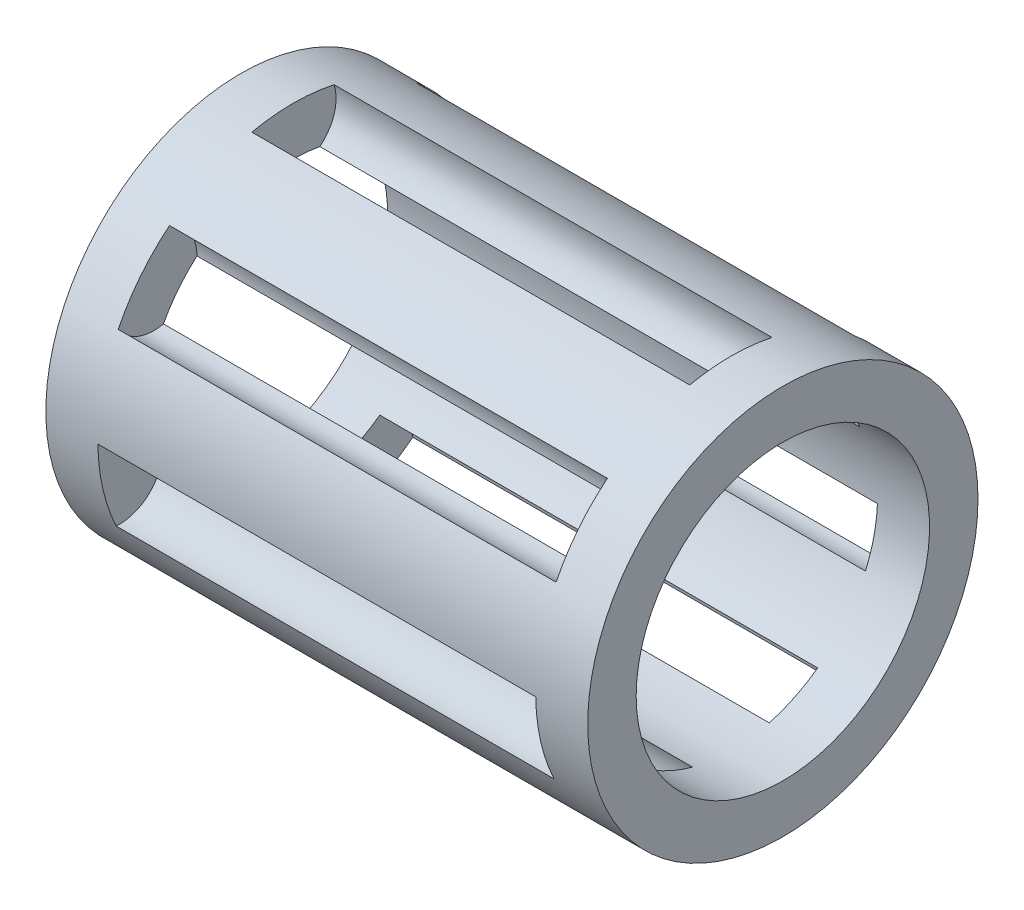
ISO-10303-21;
HEADER;
FILE_DESCRIPTION(('STEP AP214'),'2;1');
FILE_NAME('part.step','',(''),(''),'','','');
FILE_SCHEMA(('AUTOMOTIVE_DESIGN { 1 0 10303 214 1 1 1 1 }'));
ENDSEC;
DATA;
#1=APPLICATION_CONTEXT('core data for automotive mechanical design processes');
#2=APPLICATION_PROTOCOL_DEFINITION('international standard','automotive_design',2000,#1);
#3=PRODUCT_CONTEXT('',#1,'mechanical');
#4=PRODUCT('Part','Part','',(#3));
#5=PRODUCT_RELATED_PRODUCT_CATEGORY('part','',(#4));
#6=PRODUCT_DEFINITION_FORMATION('','',#4);
#7=PRODUCT_DEFINITION_CONTEXT('part definition',#1,'design');
#8=PRODUCT_DEFINITION('design','',#6,#7);
#9=PRODUCT_DEFINITION_SHAPE('','',#8);
#10=(LENGTH_UNIT() NAMED_UNIT(*) SI_UNIT(.MILLI.,.METRE.));
#11=(NAMED_UNIT(*) PLANE_ANGLE_UNIT() SI_UNIT($,.RADIAN.));
#12=(NAMED_UNIT(*) SI_UNIT($,.STERADIAN.) SOLID_ANGLE_UNIT());
#13=UNCERTAINTY_MEASURE_WITH_UNIT(LENGTH_MEASURE(1.E-05),#10,'distance_accuracy_value','');
#14=(GEOMETRIC_REPRESENTATION_CONTEXT(3) GLOBAL_UNCERTAINTY_ASSIGNED_CONTEXT((#13)) GLOBAL_UNIT_ASSIGNED_CONTEXT((#10,
#11,#12)) REPRESENTATION_CONTEXT('',''));
#15=CARTESIAN_POINT('',(0.,0.,0.));
#16=DIRECTION('',(0.,0.,1.));
#17=DIRECTION('',(1.,0.,0.));
#18=AXIS2_PLACEMENT_3D('',#15,#16,#17);
#19=CARTESIAN_POINT('',(10.95,0.,0.));
#20=DIRECTION('',(1.,0.,0.));
#21=DIRECTION('',(0.,0.,-1.));
#22=AXIS2_PLACEMENT_3D('',#19,#20,#21);
#23=PLANE('',#22);
#24=CARTESIAN_POINT('',(10.95,0.,0.));
#25=DIRECTION('',(1.,0.,0.));
#26=DIRECTION('',(0.,0.,-1.));
#27=AXIS2_PLACEMENT_3D('',#24,#25,#26);
#28=CIRCLE('',#27,3.565);
#29=CARTESIAN_POINT('',(10.95,0.,-3.565));
#30=VERTEX_POINT('',#29);
#31=EDGE_CURVE('E11',#30,#30,#28,.T.);
#32=ORIENTED_EDGE('',*,*,#31,.T.);
#33=EDGE_LOOP('',(#32));
#34=FACE_BOUND('',#33,.T.);
#35=CARTESIAN_POINT('',(10.95,0.,0.));
#36=DIRECTION('',(-1.,0.,0.));
#37=DIRECTION('',(0.,0.,-1.));
#38=AXIS2_PLACEMENT_3D('',#35,#36,#37);
#39=CIRCLE('',#38,2.68);
#40=CARTESIAN_POINT('',(10.95,0.,2.68));
#41=VERTEX_POINT('',#40);
#42=EDGE_CURVE('E327',#41,#41,#39,.T.);
#43=ORIENTED_EDGE('',*,*,#42,.T.);
#44=EDGE_LOOP('',(#43));
#45=FACE_BOUND('',#44,.T.);
#46=ADVANCED_FACE('F17',(#34,#45),#23,.T.);
#47=CARTESIAN_POINT('',(1.05,0.,0.));
#48=DIRECTION('',(-1.,0.,0.));
#49=DIRECTION('',(0.,0.,1.));
#50=AXIS2_PLACEMENT_3D('',#47,#48,#49);
#51=PLANE('',#50);
#52=CARTESIAN_POINT('',(1.05,0.,0.));
#53=DIRECTION('',(-1.,0.,0.));
#54=DIRECTION('',(0.,0.,-1.));
#55=AXIS2_PLACEMENT_3D('',#52,#53,#54);
#56=CIRCLE('',#55,3.565);
#57=CARTESIAN_POINT('',(1.05,0.,-3.565));
#58=VERTEX_POINT('',#57);
#59=EDGE_CURVE('E27',#58,#58,#56,.T.);
#60=ORIENTED_EDGE('',*,*,#59,.T.);
#61=EDGE_LOOP('',(#60));
#62=FACE_BOUND('',#61,.T.);
#63=CARTESIAN_POINT('',(1.05,0.,0.));
#64=DIRECTION('',(1.,0.,0.));
#65=DIRECTION('',(0.,0.,-1.));
#66=AXIS2_PLACEMENT_3D('',#63,#64,#65);
#67=CIRCLE('',#66,2.68);
#68=CARTESIAN_POINT('',(1.05,0.,2.68));
#69=VERTEX_POINT('',#68);
#70=EDGE_CURVE('E325',#69,#69,#67,.T.);
#71=ORIENTED_EDGE('',*,*,#70,.T.);
#72=EDGE_LOOP('',(#71));
#73=FACE_BOUND('',#72,.T.);
#74=ADVANCED_FACE('F484',(#62,#73),#51,.T.);
#75=CARTESIAN_POINT('',(6.,0.,0.));
#76=DIRECTION('',(-1.,0.,0.));
#77=DIRECTION('',(0.,0.,-1.));
#78=AXIS2_PLACEMENT_3D('',#75,#76,#77);
#79=CYLINDRICAL_SURFACE('',#78,3.565);
#80=ORIENTED_EDGE('',*,*,#31,.F.);
#81=EDGE_LOOP('',(#80));
#82=FACE_BOUND('',#81,.T.);
#83=ORIENTED_EDGE('',*,*,#59,.F.);
#84=EDGE_LOOP('',(#83));
#85=FACE_BOUND('',#84,.T.);
#86=DIRECTION('',(1.,0.,0.));
#87=VECTOR('',#86,1.);
#88=CARTESIAN_POINT('',(6.,3.48485673076923,-0.75166386504367));
#89=LINE('',#88,#87);
#90=CARTESIAN_POINT('',(2.,3.48485673076923,-0.75166386504367));
#91=VERTEX_POINT('',#90);
#92=CARTESIAN_POINT('',(10.,3.48485673076923,-0.75166386504367));
#93=VERTEX_POINT('',#92);
#94=EDGE_CURVE('E277',#91,#93,#89,.T.);
#95=ORIENTED_EDGE('',*,*,#94,.T.);
#96=CARTESIAN_POINT('',(10.,0.,0.));
#97=DIRECTION('',(1.,0.,0.));
#98=DIRECTION('',(0.,0.,-1.));
#99=AXIS2_PLACEMENT_3D('',#96,#97,#98);
#100=CIRCLE('',#99,3.565);
#101=CARTESIAN_POINT('',(10.,3.48485673076923,0.75166386504367));
#102=VERTEX_POINT('',#101);
#103=EDGE_CURVE('E353',#93,#102,#100,.T.);
#104=ORIENTED_EDGE('',*,*,#103,.T.);
#105=DIRECTION('',(-1.,0.,0.));
#106=VECTOR('',#105,1.);
#107=CARTESIAN_POINT('',(6.,3.48485673076923,0.75166386504367));
#108=LINE('',#107,#106);
#109=CARTESIAN_POINT('',(2.,3.48485673076923,0.75166386504367));
#110=VERTEX_POINT('',#109);
#111=EDGE_CURVE('E301',#102,#110,#108,.T.);
#112=ORIENTED_EDGE('',*,*,#111,.T.);
#113=CARTESIAN_POINT('',(2.,0.,0.));
#114=DIRECTION('',(-1.,0.,0.));
#115=DIRECTION('',(0.,0.,-1.));
#116=AXIS2_PLACEMENT_3D('',#113,#114,#115);
#117=CIRCLE('',#116,3.565);
#118=EDGE_CURVE('E253',#110,#91,#117,.T.);
#119=ORIENTED_EDGE('',*,*,#118,.T.);
#120=EDGE_LOOP('',(#95,#104,#112,#119));
#121=FACE_BOUND('',#120,.T.);
#122=DIRECTION('',(1.,0.,0.));
#123=VECTOR('',#122,1.);
#124=CARTESIAN_POINT('',(6.,2.76044710649813,2.25591594972555));
#125=LINE('',#124,#123);
#126=CARTESIAN_POINT('',(2.,2.76044710649813,2.25591594972555));
#127=VERTEX_POINT('',#126);
#128=CARTESIAN_POINT('',(10.,2.76044710649813,2.25591594972555));
#129=VERTEX_POINT('',#128);
#130=EDGE_CURVE('E281',#127,#129,#125,.T.);
#131=ORIENTED_EDGE('',*,*,#130,.T.);
#132=CARTESIAN_POINT('',(10.,0.,0.));
#133=DIRECTION('',(1.,0.,0.));
#134=DIRECTION('',(0.,0.,-1.));
#135=AXIS2_PLACEMENT_3D('',#132,#133,#134);
#136=CIRCLE('',#135,3.565);
#137=CARTESIAN_POINT('',(10.,1.58509815864864,3.19322545828644));
#138=VERTEX_POINT('',#137);
#139=EDGE_CURVE('E324',#129,#138,#136,.T.);
#140=ORIENTED_EDGE('',*,*,#139,.T.);
#141=DIRECTION('',(-1.,0.,0.));
#142=VECTOR('',#141,1.);
#143=CARTESIAN_POINT('',(6.,1.58509815864864,3.19322545828644));
#144=LINE('',#143,#142);
#145=CARTESIAN_POINT('',(2.,1.58509815864864,3.19322545828644));
#146=VERTEX_POINT('',#145);
#147=EDGE_CURVE('E222',#138,#146,#144,.T.);
#148=ORIENTED_EDGE('',*,*,#147,.T.);
#149=CARTESIAN_POINT('',(2.,0.,0.));
#150=DIRECTION('',(-1.,0.,0.));
#151=DIRECTION('',(0.,0.,-1.));
#152=AXIS2_PLACEMENT_3D('',#149,#150,#151);
#153=CIRCLE('',#152,3.565);
#154=EDGE_CURVE('E219',#146,#127,#153,.T.);
#155=ORIENTED_EDGE('',*,*,#154,.T.);
#156=EDGE_LOOP('',(#131,#140,#148,#155));
#157=FACE_BOUND('',#156,.T.);
#158=DIRECTION('',(1.,0.,0.));
#159=VECTOR('',#158,1.);
#160=CARTESIAN_POINT('',(6.,-0.0426354918251722,3.56474504205235));
#161=LINE('',#160,#159);
#162=CARTESIAN_POINT('',(2.,-0.0426354918251722,3.56474504205235));
#163=VERTEX_POINT('',#162);
#164=CARTESIAN_POINT('',(10.,-0.0426354918251722,3.56474504205235));
#165=VERTEX_POINT('',#164);
#166=EDGE_CURVE('E210',#163,#165,#161,.T.);
#167=ORIENTED_EDGE('',*,*,#166,.T.);
#168=CARTESIAN_POINT('',(10.,0.,0.));
#169=DIRECTION('',(1.,0.,0.));
#170=DIRECTION('',(0.,0.,-1.));
#171=AXIS2_PLACEMENT_3D('',#168,#169,#170);
#172=CIRCLE('',#171,3.565);
#173=CARTESIAN_POINT('',(10.,-1.50827165704426,3.23022315151089));
#174=VERTEX_POINT('',#173);
#175=EDGE_CURVE('E297',#165,#174,#172,.T.);
#176=ORIENTED_EDGE('',*,*,#175,.T.);
#177=DIRECTION('',(-1.,0.,0.));
#178=VECTOR('',#177,1.);
#179=CARTESIAN_POINT('',(6.,-1.50827165704426,3.23022315151089));
#180=LINE('',#179,#178);
#181=CARTESIAN_POINT('',(2.,-1.50827165704426,3.23022315151089));
#182=VERTEX_POINT('',#181);
#183=EDGE_CURVE('E377',#174,#182,#180,.T.);
#184=ORIENTED_EDGE('',*,*,#183,.T.);
#185=CARTESIAN_POINT('',(2.,0.,0.));
#186=DIRECTION('',(-1.,0.,0.));
#187=DIRECTION('',(0.,0.,-1.));
#188=AXIS2_PLACEMENT_3D('',#185,#186,#187);
#189=CIRCLE('',#188,3.565);
#190=EDGE_CURVE('E241',#182,#163,#189,.T.);
#191=ORIENTED_EDGE('',*,*,#190,.T.);
#192=EDGE_LOOP('',(#167,#176,#184,#191));
#193=FACE_BOUND('',#192,.T.);
#194=DIRECTION('',(1.,0.,0.));
#195=VECTOR('',#194,1.);
#196=CARTESIAN_POINT('',(6.,-2.81361269519858,2.1892484101667));
#197=LINE('',#196,#195);
#198=CARTESIAN_POINT('',(2.,-2.81361269519858,2.1892484101667));
#199=VERTEX_POINT('',#198);
#200=CARTESIAN_POINT('',(10.,-2.81361269519858,2.1892484101667));
#201=VERTEX_POINT('',#200);
#202=EDGE_CURVE('E363',#199,#201,#197,.T.);
#203=ORIENTED_EDGE('',*,*,#202,.T.);
#204=CARTESIAN_POINT('',(10.,0.,0.));
#205=DIRECTION('',(1.,0.,0.));
#206=DIRECTION('',(0.,0.,-1.));
#207=AXIS2_PLACEMENT_3D('',#204,#205,#206);
#208=CIRCLE('',#207,3.565);
#209=CARTESIAN_POINT('',(10.,-3.46588215184798,0.834796927103591));
#210=VERTEX_POINT('',#209);
#211=EDGE_CURVE('E293',#201,#210,#208,.T.);
#212=ORIENTED_EDGE('',*,*,#211,.T.);
#213=DIRECTION('',(-1.,0.,0.));
#214=VECTOR('',#213,1.);
#215=CARTESIAN_POINT('',(6.,-3.46588215184798,0.834796927103591));
#216=LINE('',#215,#214);
#217=CARTESIAN_POINT('',(2.,-3.46588215184798,0.834796927103591));
#218=VERTEX_POINT('',#217);
#219=EDGE_CURVE('E180',#210,#218,#216,.T.);
#220=ORIENTED_EDGE('',*,*,#219,.T.);
#221=CARTESIAN_POINT('',(2.,0.,0.));
#222=DIRECTION('',(-1.,0.,0.));
#223=DIRECTION('',(0.,0.,-1.));
#224=AXIS2_PLACEMENT_3D('',#221,#222,#223);
#225=CIRCLE('',#224,3.565);
#226=EDGE_CURVE('E188',#218,#199,#225,.T.);
#227=ORIENTED_EDGE('',*,*,#226,.T.);
#228=EDGE_LOOP('',(#203,#212,#220,#227));
#229=FACE_BOUND('',#228,.T.);
#230=DIRECTION('',(1.,0.,0.));
#231=VECTOR('',#230,1.);
#232=CARTESIAN_POINT('',(6.,-3.46588215184798,-0.834796927103591));
#233=LINE('',#232,#231);
#234=CARTESIAN_POINT('',(2.,-3.46588215184798,-0.834796927103591));
#235=VERTEX_POINT('',#234);
#236=CARTESIAN_POINT('',(10.,-3.46588215184798,-0.834796927103591));
#237=VERTEX_POINT('',#236);
#238=EDGE_CURVE('E314',#235,#237,#233,.T.);
#239=ORIENTED_EDGE('',*,*,#238,.T.);
#240=CARTESIAN_POINT('',(10.,0.,0.));
#241=DIRECTION('',(1.,0.,0.));
#242=DIRECTION('',(0.,0.,-1.));
#243=AXIS2_PLACEMENT_3D('',#240,#241,#242);
#244=CIRCLE('',#243,3.565);
#245=CARTESIAN_POINT('',(10.,-2.81361269519858,-2.1892484101667));
#246=VERTEX_POINT('',#245);
#247=EDGE_CURVE('E196',#237,#246,#244,.T.);
#248=ORIENTED_EDGE('',*,*,#247,.T.);
#249=DIRECTION('',(-1.,0.,0.));
#250=VECTOR('',#249,1.);
#251=CARTESIAN_POINT('',(6.,-2.81361269519858,-2.1892484101667));
#252=LINE('',#251,#250);
#253=CARTESIAN_POINT('',(2.,-2.81361269519858,-2.1892484101667));
#254=VERTEX_POINT('',#253);
#255=EDGE_CURVE('E312',#246,#254,#252,.T.);
#256=ORIENTED_EDGE('',*,*,#255,.T.);
#257=CARTESIAN_POINT('',(2.,0.,0.));
#258=DIRECTION('',(-1.,0.,0.));
#259=DIRECTION('',(0.,0.,-1.));
#260=AXIS2_PLACEMENT_3D('',#257,#258,#259);
#261=CIRCLE('',#260,3.565);
#262=EDGE_CURVE('E320',#254,#235,#261,.T.);
#263=ORIENTED_EDGE('',*,*,#262,.T.);
#264=EDGE_LOOP('',(#239,#248,#256,#263));
#265=FACE_BOUND('',#264,.T.);
#266=DIRECTION('',(1.,0.,0.));
#267=VECTOR('',#266,1.);
#268=CARTESIAN_POINT('',(6.,-1.50827165704426,-3.23022315151089));
#269=LINE('',#268,#267);
#270=CARTESIAN_POINT('',(2.,-1.50827165704426,-3.23022315151089));
#271=VERTEX_POINT('',#270);
#272=CARTESIAN_POINT('',(10.,-1.50827165704426,-3.23022315151089));
#273=VERTEX_POINT('',#272);
#274=EDGE_CURVE('E223',#271,#273,#269,.T.);
#275=ORIENTED_EDGE('',*,*,#274,.T.);
#276=CARTESIAN_POINT('',(10.,0.,0.));
#277=DIRECTION('',(1.,0.,0.));
#278=DIRECTION('',(0.,0.,-1.));
#279=AXIS2_PLACEMENT_3D('',#276,#277,#278);
#280=CIRCLE('',#279,3.565);
#281=CARTESIAN_POINT('',(10.,-0.0426354918251729,-3.56474504205235));
#282=VERTEX_POINT('',#281);
#283=EDGE_CURVE('E329',#273,#282,#280,.T.);
#284=ORIENTED_EDGE('',*,*,#283,.T.);
#285=DIRECTION('',(-1.,0.,0.));
#286=VECTOR('',#285,1.);
#287=CARTESIAN_POINT('',(6.,-0.0426354918251729,-3.56474504205235));
#288=LINE('',#287,#286);
#289=CARTESIAN_POINT('',(2.,-0.0426354918251729,-3.56474504205235));
#290=VERTEX_POINT('',#289);
#291=EDGE_CURVE('E208',#282,#290,#288,.T.);
#292=ORIENTED_EDGE('',*,*,#291,.T.);
#293=CARTESIAN_POINT('',(2.,0.,0.));
#294=DIRECTION('',(-1.,0.,0.));
#295=DIRECTION('',(0.,0.,-1.));
#296=AXIS2_PLACEMENT_3D('',#293,#294,#295);
#297=CIRCLE('',#296,3.565);
#298=EDGE_CURVE('E354',#290,#271,#297,.T.);
#299=ORIENTED_EDGE('',*,*,#298,.T.);
#300=EDGE_LOOP('',(#275,#284,#292,#299));
#301=FACE_BOUND('',#300,.T.);
#302=DIRECTION('',(1.,0.,0.));
#303=VECTOR('',#302,1.);
#304=CARTESIAN_POINT('',(6.,1.58509815864864,-3.19322545828645));
#305=LINE('',#304,#303);
#306=CARTESIAN_POINT('',(2.,1.58509815864864,-3.19322545828645));
#307=VERTEX_POINT('',#306);
#308=CARTESIAN_POINT('',(10.,1.58509815864864,-3.19322545828645));
#309=VERTEX_POINT('',#308);
#310=EDGE_CURVE('E245',#307,#309,#305,.T.);
#311=ORIENTED_EDGE('',*,*,#310,.T.);
#312=CARTESIAN_POINT('',(10.,0.,0.));
#313=DIRECTION('',(1.,0.,0.));
#314=DIRECTION('',(0.,0.,-1.));
#315=AXIS2_PLACEMENT_3D('',#312,#313,#314);
#316=CIRCLE('',#315,3.565);
#317=CARTESIAN_POINT('',(10.,2.76044710649813,-2.25591594972555));
#318=VERTEX_POINT('',#317);
#319=EDGE_CURVE('E232',#309,#318,#316,.T.);
#320=ORIENTED_EDGE('',*,*,#319,.T.);
#321=DIRECTION('',(-1.,0.,0.));
#322=VECTOR('',#321,1.);
#323=CARTESIAN_POINT('',(6.,2.76044710649813,-2.25591594972555));
#324=LINE('',#323,#322);
#325=CARTESIAN_POINT('',(2.,2.76044710649813,-2.25591594972555));
#326=VERTEX_POINT('',#325);
#327=EDGE_CURVE('E266',#318,#326,#324,.T.);
#328=ORIENTED_EDGE('',*,*,#327,.T.);
#329=CARTESIAN_POINT('',(2.,0.,0.));
#330=DIRECTION('',(-1.,0.,0.));
#331=DIRECTION('',(0.,0.,-1.));
#332=AXIS2_PLACEMENT_3D('',#329,#330,#331);
#333=CIRCLE('',#332,3.565);
#334=EDGE_CURVE('E345',#326,#307,#333,.T.);
#335=ORIENTED_EDGE('',*,*,#334,.T.);
#336=EDGE_LOOP('',(#311,#320,#328,#335));
#337=FACE_BOUND('',#336,.T.);
#338=ADVANCED_FACE('F481',(#82,#85,#121,#157,#193,#229,#265,#301,#337),#79,.T.);
#339=CARTESIAN_POINT('',(6.,0.,0.));
#340=DIRECTION('',(-1.,0.,0.));
#341=DIRECTION('',(0.,0.,-1.));
#342=AXIS2_PLACEMENT_3D('',#339,#340,#341);
#343=CYLINDRICAL_SURFACE('',#342,2.68);
#344=ORIENTED_EDGE('',*,*,#70,.F.);
#345=EDGE_LOOP('',(#344));
#346=FACE_BOUND('',#345,.T.);
#347=ORIENTED_EDGE('',*,*,#42,.F.);
#348=EDGE_LOOP('',(#347));
#349=FACE_BOUND('',#348,.T.);
#350=DIRECTION('',(1.,0.,0.));
#351=VECTOR('',#350,1.);
#352=CARTESIAN_POINT('',(6.,2.63457596153846,0.491334410441291));
#353=LINE('',#352,#351);
#354=CARTESIAN_POINT('',(2.,2.63457596153846,0.491334410441291));
#355=VERTEX_POINT('',#354);
#356=CARTESIAN_POINT('',(10.,2.63457596153846,0.491334410441291));
#357=VERTEX_POINT('',#356);
#358=EDGE_CURVE('E383',#355,#357,#353,.T.);
#359=ORIENTED_EDGE('',*,*,#358,.T.);
#360=CARTESIAN_POINT('',(10.,0.,0.));
#361=DIRECTION('',(-1.,0.,0.));
#362=DIRECTION('',(0.,0.,-1.));
#363=AXIS2_PLACEMENT_3D('',#360,#361,#362);
#364=CIRCLE('',#363,2.68);
#365=CARTESIAN_POINT('',(10.,2.63457596153846,-0.491334410441291));
#366=VERTEX_POINT('',#365);
#367=EDGE_CURVE('E351',#357,#366,#364,.T.);
#368=ORIENTED_EDGE('',*,*,#367,.T.);
#369=DIRECTION('',(-1.,0.,0.));
#370=VECTOR('',#369,1.);
#371=CARTESIAN_POINT('',(6.,2.63457596153846,-0.491334410441291));
#372=LINE('',#371,#370);
#373=CARTESIAN_POINT('',(2.,2.63457596153846,-0.491334410441291));
#374=VERTEX_POINT('',#373);
#375=EDGE_CURVE('E255',#366,#374,#372,.T.);
#376=ORIENTED_EDGE('',*,*,#375,.T.);
#377=CARTESIAN_POINT('',(2.,0.,0.));
#378=DIRECTION('',(1.,0.,0.));
#379=DIRECTION('',(0.,0.,-1.));
#380=AXIS2_PLACEMENT_3D('',#377,#378,#379);
#381=CIRCLE('',#380,2.68);
#382=EDGE_CURVE('E254',#374,#355,#381,.T.);
#383=ORIENTED_EDGE('',*,*,#382,.T.);
#384=EDGE_LOOP('',(#359,#368,#376,#383));
#385=FACE_BOUND('',#384,.T.);
#386=DIRECTION('',(1.,0.,0.));
#387=VECTOR('',#386,1.);
#388=CARTESIAN_POINT('',(6.,1.25849053373853,2.36613642389667));
#389=LINE('',#388,#387);
#390=CARTESIAN_POINT('',(2.,1.25849053373853,2.36613642389667));
#391=VERTEX_POINT('',#390);
#392=CARTESIAN_POINT('',(10.,1.25849053373853,2.36613642389667));
#393=VERTEX_POINT('',#392);
#394=EDGE_CURVE('E218',#391,#393,#389,.T.);
#395=ORIENTED_EDGE('',*,*,#394,.T.);
#396=CARTESIAN_POINT('',(10.,0.,0.));
#397=DIRECTION('',(-1.,0.,0.));
#398=DIRECTION('',(0.,0.,-1.));
#399=AXIS2_PLACEMENT_3D('',#396,#397,#398);
#400=CIRCLE('',#399,2.68);
#401=CARTESIAN_POINT('',(10.,2.02677195474427,1.75345243547183));
#402=VERTEX_POINT('',#401);
#403=EDGE_CURVE('E307',#393,#402,#400,.T.);
#404=ORIENTED_EDGE('',*,*,#403,.T.);
#405=DIRECTION('',(-1.,0.,0.));
#406=VECTOR('',#405,1.);
#407=CARTESIAN_POINT('',(6.,2.02677195474427,1.75345243547183));
#408=LINE('',#407,#406);
#409=CARTESIAN_POINT('',(2.,2.02677195474427,1.75345243547183));
#410=VERTEX_POINT('',#409);
#411=EDGE_CURVE('E282',#402,#410,#408,.T.);
#412=ORIENTED_EDGE('',*,*,#411,.T.);
#413=CARTESIAN_POINT('',(2.,0.,0.));
#414=DIRECTION('',(1.,0.,0.));
#415=DIRECTION('',(0.,0.,-1.));
#416=AXIS2_PLACEMENT_3D('',#413,#414,#415);
#417=CIRCLE('',#416,2.68);
#418=EDGE_CURVE('E236',#410,#391,#417,.T.);
#419=ORIENTED_EDGE('',*,*,#418,.T.);
#420=EDGE_LOOP('',(#395,#404,#412,#419));
#421=FACE_BOUND('',#420,.T.);
#422=DIRECTION('',(1.,0.,0.));
#423=VECTOR('',#422,1.);
#424=CARTESIAN_POINT('',(6.,-1.06526393449501,2.45918944977084));
#425=LINE('',#424,#423);
#426=CARTESIAN_POINT('',(2.,-1.06526393449501,2.45918944977084));
#427=VERTEX_POINT('',#426);
#428=CARTESIAN_POINT('',(10.,-1.06526393449501,2.45918944977084));
#429=VERTEX_POINT('',#428);
#430=EDGE_CURVE('E240',#427,#429,#425,.T.);
#431=ORIENTED_EDGE('',*,*,#430,.T.);
#432=CARTESIAN_POINT('',(10.,0.,0.));
#433=DIRECTION('',(-1.,0.,0.));
#434=DIRECTION('',(0.,0.,-1.));
#435=AXIS2_PLACEMENT_3D('',#432,#433,#434);
#436=CIRCLE('',#435,2.68);
#437=CARTESIAN_POINT('',(10.,-0.107232672585778,2.67785383356338));
#438=VERTEX_POINT('',#437);
#439=EDGE_CURVE('E213',#429,#438,#436,.T.);
#440=ORIENTED_EDGE('',*,*,#439,.T.);
#441=DIRECTION('',(-1.,0.,0.));
#442=VECTOR('',#441,1.);
#443=CARTESIAN_POINT('',(6.,-0.107232672585778,2.67785383356338));
#444=LINE('',#443,#442);
#445=CARTESIAN_POINT('',(2.,-0.107232672585778,2.67785383356338));
#446=VERTEX_POINT('',#445);
#447=EDGE_CURVE('E244',#438,#446,#444,.T.);
#448=ORIENTED_EDGE('',*,*,#447,.T.);
#449=CARTESIAN_POINT('',(2.,0.,0.));
#450=DIRECTION('',(1.,0.,0.));
#451=DIRECTION('',(0.,0.,-1.));
#452=AXIS2_PLACEMENT_3D('',#449,#450,#451);
#453=CIRCLE('',#452,2.68);
#454=EDGE_CURVE('E289',#446,#427,#453,.T.);
#455=ORIENTED_EDGE('',*,*,#454,.T.);
#456=EDGE_LOOP('',(#431,#440,#448,#455));
#457=FACE_BOUND('',#456,.T.);
#458=DIRECTION('',(1.,0.,0.));
#459=VECTOR('',#458,1.);
#460=CARTESIAN_POINT('',(6.,-2.58685293262962,0.700422661644752));
#461=LINE('',#460,#459);
#462=CARTESIAN_POINT('',(2.,-2.58685293262962,0.700422661644752));
#463=VERTEX_POINT('',#462);
#464=CARTESIAN_POINT('',(10.,-2.58685293262962,0.700422661644752));
#465=VERTEX_POINT('',#464);
#466=EDGE_CURVE('E169',#463,#465,#461,.T.);
#467=ORIENTED_EDGE('',*,*,#466,.T.);
#468=CARTESIAN_POINT('',(10.,0.,0.));
#469=DIRECTION('',(-1.,0.,0.));
#470=DIRECTION('',(0.,0.,-1.));
#471=AXIS2_PLACEMENT_3D('',#468,#469,#470);
#472=CIRCLE('',#471,2.68);
#473=CARTESIAN_POINT('',(10.,-2.16048891031085,1.58577667671833));
#474=VERTEX_POINT('',#473);
#475=EDGE_CURVE('E364',#465,#474,#472,.T.);
#476=ORIENTED_EDGE('',*,*,#475,.T.);
#477=DIRECTION('',(-1.,0.,0.));
#478=VECTOR('',#477,1.);
#479=CARTESIAN_POINT('',(6.,-2.16048891031085,1.58577667671833));
#480=LINE('',#479,#478);
#481=CARTESIAN_POINT('',(2.,-2.16048891031085,1.58577667671833));
#482=VERTEX_POINT('',#481);
#483=EDGE_CURVE('E193',#474,#482,#480,.T.);
#484=ORIENTED_EDGE('',*,*,#483,.T.);
#485=CARTESIAN_POINT('',(2.,0.,0.));
#486=DIRECTION('',(1.,0.,0.));
#487=DIRECTION('',(0.,0.,-1.));
#488=AXIS2_PLACEMENT_3D('',#485,#486,#487);
#489=CIRCLE('',#488,2.68);
#490=EDGE_CURVE('E186',#482,#463,#489,.T.);
#491=ORIENTED_EDGE('',*,*,#490,.T.);
#492=EDGE_LOOP('',(#467,#476,#484,#491));
#493=FACE_BOUND('',#492,.T.);
#494=DIRECTION('',(1.,0.,0.));
#495=VECTOR('',#494,1.);
#496=CARTESIAN_POINT('',(6.,-2.16048891031085,-1.58577667671833));
#497=LINE('',#496,#495);
#498=CARTESIAN_POINT('',(2.,-2.16048891031085,-1.58577667671833));
#499=VERTEX_POINT('',#498);
#500=CARTESIAN_POINT('',(10.,-2.16048891031085,-1.58577667671833));
#501=VERTEX_POINT('',#500);
#502=EDGE_CURVE('E21',#499,#501,#497,.T.);
#503=ORIENTED_EDGE('',*,*,#502,.T.);
#504=CARTESIAN_POINT('',(10.,0.,0.));
#505=DIRECTION('',(-1.,0.,0.));
#506=DIRECTION('',(0.,0.,-1.));
#507=AXIS2_PLACEMENT_3D('',#504,#505,#506);
#508=CIRCLE('',#507,2.68);
#509=CARTESIAN_POINT('',(10.,-2.58685293262962,-0.700422661644751));
#510=VERTEX_POINT('',#509);
#511=EDGE_CURVE('E199',#501,#510,#508,.T.);
#512=ORIENTED_EDGE('',*,*,#511,.T.);
#513=DIRECTION('',(-1.,0.,0.));
#514=VECTOR('',#513,1.);
#515=CARTESIAN_POINT('',(6.,-2.58685293262962,-0.700422661644751));
#516=LINE('',#515,#514);
#517=CARTESIAN_POINT('',(2.,-2.58685293262962,-0.700422661644751));
#518=VERTEX_POINT('',#517);
#519=EDGE_CURVE('E311',#510,#518,#516,.T.);
#520=ORIENTED_EDGE('',*,*,#519,.T.);
#521=CARTESIAN_POINT('',(2.,0.,0.));
#522=DIRECTION('',(1.,0.,0.));
#523=DIRECTION('',(0.,0.,-1.));
#524=AXIS2_PLACEMENT_3D('',#521,#522,#523);
#525=CIRCLE('',#524,2.68);
#526=EDGE_CURVE('E203',#518,#499,#525,.T.);
#527=ORIENTED_EDGE('',*,*,#526,.T.);
#528=EDGE_LOOP('',(#503,#512,#520,#527));
#529=FACE_BOUND('',#528,.T.);
#530=DIRECTION('',(1.,0.,0.));
#531=VECTOR('',#530,1.);
#532=CARTESIAN_POINT('',(6.,-0.107232672585779,-2.67785383356338));
#533=LINE('',#532,#531);
#534=CARTESIAN_POINT('',(2.,-0.107232672585779,-2.67785383356338));
#535=VERTEX_POINT('',#534);
#536=CARTESIAN_POINT('',(10.,-0.107232672585779,-2.67785383356338));
#537=VERTEX_POINT('',#536);
#538=EDGE_CURVE('E205',#535,#537,#533,.T.);
#539=ORIENTED_EDGE('',*,*,#538,.T.);
#540=CARTESIAN_POINT('',(10.,0.,0.));
#541=DIRECTION('',(-1.,0.,0.));
#542=DIRECTION('',(0.,0.,-1.));
#543=AXIS2_PLACEMENT_3D('',#540,#541,#542);
#544=CIRCLE('',#543,2.68);
#545=CARTESIAN_POINT('',(10.,-1.06526393449501,-2.45918944977084));
#546=VERTEX_POINT('',#545);
#547=EDGE_CURVE('E226',#537,#546,#544,.T.);
#548=ORIENTED_EDGE('',*,*,#547,.T.);
#549=DIRECTION('',(-1.,0.,0.));
#550=VECTOR('',#549,1.);
#551=CARTESIAN_POINT('',(6.,-1.06526393449501,-2.45918944977084));
#552=LINE('',#551,#550);
#553=CARTESIAN_POINT('',(2.,-1.06526393449501,-2.45918944977084));
#554=VERTEX_POINT('',#553);
#555=EDGE_CURVE('E265',#546,#554,#552,.T.);
#556=ORIENTED_EDGE('',*,*,#555,.T.);
#557=CARTESIAN_POINT('',(2.,0.,0.));
#558=DIRECTION('',(1.,0.,0.));
#559=DIRECTION('',(0.,0.,-1.));
#560=AXIS2_PLACEMENT_3D('',#557,#558,#559);
#561=CIRCLE('',#560,2.68);
#562=EDGE_CURVE('E228',#554,#535,#561,.T.);
#563=ORIENTED_EDGE('',*,*,#562,.T.);
#564=EDGE_LOOP('',(#539,#548,#556,#563));
#565=FACE_BOUND('',#564,.T.);
#566=DIRECTION('',(1.,0.,0.));
#567=VECTOR('',#566,1.);
#568=CARTESIAN_POINT('',(6.,2.02677195474426,-1.75345243547184));
#569=LINE('',#568,#567);
#570=CARTESIAN_POINT('',(2.,2.02677195474426,-1.75345243547184));
#571=VERTEX_POINT('',#570);
#572=CARTESIAN_POINT('',(10.,2.02677195474426,-1.75345243547184));
#573=VERTEX_POINT('',#572);
#574=EDGE_CURVE('E269',#571,#573,#569,.T.);
#575=ORIENTED_EDGE('',*,*,#574,.T.);
#576=CARTESIAN_POINT('',(10.,0.,0.));
#577=DIRECTION('',(-1.,0.,0.));
#578=DIRECTION('',(0.,0.,-1.));
#579=AXIS2_PLACEMENT_3D('',#576,#577,#578);
#580=CIRCLE('',#579,2.68);
#581=CARTESIAN_POINT('',(10.,1.25849053373853,-2.36613642389667));
#582=VERTEX_POINT('',#581);
#583=EDGE_CURVE('E248',#573,#582,#580,.T.);
#584=ORIENTED_EDGE('',*,*,#583,.T.);
#585=DIRECTION('',(-1.,0.,0.));
#586=VECTOR('',#585,1.);
#587=CARTESIAN_POINT('',(6.,1.25849053373853,-2.36613642389667));
#588=LINE('',#587,#586);
#589=CARTESIAN_POINT('',(2.,1.25849053373853,-2.36613642389667));
#590=VERTEX_POINT('',#589);
#591=EDGE_CURVE('E288',#582,#590,#588,.T.);
#592=ORIENTED_EDGE('',*,*,#591,.T.);
#593=CARTESIAN_POINT('',(2.,0.,0.));
#594=DIRECTION('',(1.,0.,0.));
#595=DIRECTION('',(0.,0.,-1.));
#596=AXIS2_PLACEMENT_3D('',#593,#594,#595);
#597=CIRCLE('',#596,2.68);
#598=EDGE_CURVE('E330',#590,#571,#597,.T.);
#599=ORIENTED_EDGE('',*,*,#598,.T.);
#600=EDGE_LOOP('',(#575,#584,#592,#599));
#601=FACE_BOUND('',#600,.T.);
#602=ADVANCED_FACE('F190',(#346,#349,#385,#421,#457,#493,#529,#565,#601),#343,.F.);
#603=CARTESIAN_POINT('',(10.,3.25,0.));
#604=DIRECTION('',(1.,0.,0.));
#605=DIRECTION('',(0.,0.,-1.));
#606=AXIS2_PLACEMENT_3D('',#603,#604,#605);
#607=PLANE('',#606);
#608=ORIENTED_EDGE('',*,*,#367,.F.);
#609=CARTESIAN_POINT('',(10.,3.25,0.));
#610=DIRECTION('',(1.,0.,0.));
#611=DIRECTION('',(0.,0.,-1.));
#612=AXIS2_PLACEMENT_3D('',#609,#610,#611);
#613=CIRCLE('',#612,0.7875);
#614=EDGE_CURVE('E259',#102,#357,#613,.T.);
#615=ORIENTED_EDGE('',*,*,#614,.F.);
#616=ORIENTED_EDGE('',*,*,#103,.F.);
#617=CARTESIAN_POINT('',(10.,3.25,0.));
#618=DIRECTION('',(1.,0.,0.));
#619=DIRECTION('',(0.,0.,-1.));
#620=AXIS2_PLACEMENT_3D('',#617,#618,#619);
#621=CIRCLE('',#620,0.7875);
#622=EDGE_CURVE('E258',#366,#93,#621,.T.);
#623=ORIENTED_EDGE('',*,*,#622,.F.);
#624=EDGE_LOOP('',(#608,#615,#616,#623));
#625=FACE_BOUND('',#624,.T.);
#626=ADVANCED_FACE('F479',(#625),#607,.F.);
#627=CARTESIAN_POINT('',(6.,3.25,0.));
#628=DIRECTION('',(-1.,0.,0.));
#629=DIRECTION('',(0.,0.,-1.));
#630=AXIS2_PLACEMENT_3D('',#627,#628,#629);
#631=CYLINDRICAL_SURFACE('',#630,0.7875);
#632=ORIENTED_EDGE('',*,*,#375,.F.);
#633=ORIENTED_EDGE('',*,*,#622,.T.);
#634=ORIENTED_EDGE('',*,*,#94,.F.);
#635=CARTESIAN_POINT('',(2.,3.25,0.));
#636=DIRECTION('',(-1.,0.,0.));
#637=DIRECTION('',(0.,0.,-1.));
#638=AXIS2_PLACEMENT_3D('',#635,#636,#637);
#639=CIRCLE('',#638,0.7875);
#640=EDGE_CURVE('E250',#91,#374,#639,.T.);
#641=ORIENTED_EDGE('',*,*,#640,.T.);
#642=EDGE_LOOP('',(#632,#633,#634,#641));
#643=FACE_BOUND('',#642,.T.);
#644=ADVANCED_FACE('F470',(#643),#631,.F.);
#645=CARTESIAN_POINT('',(6.,3.25,0.));
#646=DIRECTION('',(-1.,0.,0.));
#647=DIRECTION('',(0.,0.,-1.));
#648=AXIS2_PLACEMENT_3D('',#645,#646,#647);
#649=CYLINDRICAL_SURFACE('',#648,0.7875);
#650=ORIENTED_EDGE('',*,*,#358,.F.);
#651=CARTESIAN_POINT('',(2.,3.25,0.));
#652=DIRECTION('',(-1.,0.,0.));
#653=DIRECTION('',(0.,0.,-1.));
#654=AXIS2_PLACEMENT_3D('',#651,#652,#653);
#655=CIRCLE('',#654,0.7875);
#656=EDGE_CURVE('E274',#355,#110,#655,.T.);
#657=ORIENTED_EDGE('',*,*,#656,.T.);
#658=ORIENTED_EDGE('',*,*,#111,.F.);
#659=ORIENTED_EDGE('',*,*,#614,.T.);
#660=EDGE_LOOP('',(#650,#657,#658,#659));
#661=FACE_BOUND('',#660,.T.);
#662=ADVANCED_FACE('F19',(#661),#649,.F.);
#663=CARTESIAN_POINT('',(2.,3.25,0.));
#664=DIRECTION('',(-1.,0.,0.));
#665=DIRECTION('',(0.,0.,1.));
#666=AXIS2_PLACEMENT_3D('',#663,#664,#665);
#667=PLANE('',#666);
#668=ORIENTED_EDGE('',*,*,#382,.F.);
#669=ORIENTED_EDGE('',*,*,#640,.F.);
#670=ORIENTED_EDGE('',*,*,#118,.F.);
#671=ORIENTED_EDGE('',*,*,#656,.F.);
#672=EDGE_LOOP('',(#668,#669,#670,#671));
#673=FACE_BOUND('',#672,.T.);
#674=ADVANCED_FACE('F474',(#673),#667,.F.);
#675=CARTESIAN_POINT('',(10.,2.02634185604088,2.5409523180211));
#676=DIRECTION('',(1.,0.,0.));
#677=DIRECTION('',(0.,0.78183148246803,-0.623489801858734));
#678=AXIS2_PLACEMENT_3D('',#675,#676,#677);
#679=PLANE('',#678);
#680=ORIENTED_EDGE('',*,*,#403,.F.);
#681=CARTESIAN_POINT('',(10.,2.02634185604088,2.5409523180211));
#682=DIRECTION('',(1.,0.,0.));
#683=DIRECTION('',(0.,0.78183148246803,-0.623489801858734));
#684=AXIS2_PLACEMENT_3D('',#681,#682,#683);
#685=CIRCLE('',#684,0.7875);
#686=EDGE_CURVE('E294',#138,#393,#685,.T.);
#687=ORIENTED_EDGE('',*,*,#686,.F.);
#688=ORIENTED_EDGE('',*,*,#139,.F.);
#689=CARTESIAN_POINT('',(10.,2.02634185604088,2.5409523180211));
#690=DIRECTION('',(1.,0.,0.));
#691=DIRECTION('',(0.,0.78183148246803,-0.623489801858734));
#692=AXIS2_PLACEMENT_3D('',#689,#690,#691);
#693=CIRCLE('',#692,0.7875);
#694=EDGE_CURVE('E278',#402,#129,#693,.T.);
#695=ORIENTED_EDGE('',*,*,#694,.F.);
#696=EDGE_LOOP('',(#680,#687,#688,#695));
#697=FACE_BOUND('',#696,.T.);
#698=ADVANCED_FACE('F552',(#697),#679,.F.);
#699=CARTESIAN_POINT('',(6.,2.02634185604088,2.5409523180211));
#700=DIRECTION('',(-1.,0.,0.));
#701=DIRECTION('',(0.,0.78183148246803,-0.623489801858734));
#702=AXIS2_PLACEMENT_3D('',#699,#700,#701);
#703=CYLINDRICAL_SURFACE('',#702,0.7875);
#704=ORIENTED_EDGE('',*,*,#411,.F.);
#705=ORIENTED_EDGE('',*,*,#694,.T.);
#706=ORIENTED_EDGE('',*,*,#130,.F.);
#707=CARTESIAN_POINT('',(2.,2.02634185604088,2.5409523180211));
#708=DIRECTION('',(-1.,0.,0.));
#709=DIRECTION('',(0.,0.78183148246803,-0.623489801858734));
#710=AXIS2_PLACEMENT_3D('',#707,#708,#709);
#711=CIRCLE('',#710,0.7875);
#712=EDGE_CURVE('E233',#127,#410,#711,.T.);
#713=ORIENTED_EDGE('',*,*,#712,.T.);
#714=EDGE_LOOP('',(#704,#705,#706,#713));
#715=FACE_BOUND('',#714,.T.);
#716=ADVANCED_FACE('F549',(#715),#703,.F.);
#717=CARTESIAN_POINT('',(6.,2.02634185604088,2.5409523180211));
#718=DIRECTION('',(-1.,0.,0.));
#719=DIRECTION('',(0.,0.78183148246803,-0.623489801858734));
#720=AXIS2_PLACEMENT_3D('',#717,#718,#719);
#721=CYLINDRICAL_SURFACE('',#720,0.7875);
#722=ORIENTED_EDGE('',*,*,#394,.F.);
#723=CARTESIAN_POINT('',(2.,2.02634185604088,2.5409523180211));
#724=DIRECTION('',(-1.,0.,0.));
#725=DIRECTION('',(0.,0.78183148246803,-0.623489801858734));
#726=AXIS2_PLACEMENT_3D('',#723,#724,#725);
#727=CIRCLE('',#726,0.7875);
#728=EDGE_CURVE('E215',#391,#146,#727,.T.);
#729=ORIENTED_EDGE('',*,*,#728,.T.);
#730=ORIENTED_EDGE('',*,*,#147,.F.);
#731=ORIENTED_EDGE('',*,*,#686,.T.);
#732=EDGE_LOOP('',(#722,#729,#730,#731));
#733=FACE_BOUND('',#732,.T.);
#734=ADVANCED_FACE('F551',(#733),#721,.F.);
#735=CARTESIAN_POINT('',(2.,2.02634185604088,2.5409523180211));
#736=DIRECTION('',(-1.,0.,0.));
#737=DIRECTION('',(0.,-0.78183148246803,0.623489801858734));
#738=AXIS2_PLACEMENT_3D('',#735,#736,#737);
#739=PLANE('',#738);
#740=ORIENTED_EDGE('',*,*,#418,.F.);
#741=ORIENTED_EDGE('',*,*,#712,.F.);
#742=ORIENTED_EDGE('',*,*,#154,.F.);
#743=ORIENTED_EDGE('',*,*,#728,.F.);
#744=EDGE_LOOP('',(#740,#741,#742,#743));
#745=FACE_BOUND('',#744,.T.);
#746=ADVANCED_FACE('F645',(#745),#739,.F.);
#747=CARTESIAN_POINT('',(10.,-0.723193035358022,3.16851571459092));
#748=DIRECTION('',(1.,0.,0.));
#749=DIRECTION('',(0.,0.974927912181824,0.222520933956315));
#750=AXIS2_PLACEMENT_3D('',#747,#748,#749);
#751=PLANE('',#750);
#752=ORIENTED_EDGE('',*,*,#439,.F.);
#753=CARTESIAN_POINT('',(10.,-0.723193035358022,3.16851571459092));
#754=DIRECTION('',(1.,0.,0.));
#755=DIRECTION('',(0.,0.974927912181824,0.222520933956315));
#756=AXIS2_PLACEMENT_3D('',#753,#754,#755);
#757=CIRCLE('',#756,0.7875);
#758=EDGE_CURVE('E370',#174,#429,#757,.T.);
#759=ORIENTED_EDGE('',*,*,#758,.F.);
#760=ORIENTED_EDGE('',*,*,#175,.F.);
#761=CARTESIAN_POINT('',(10.,-0.723193035358022,3.16851571459092));
#762=DIRECTION('',(1.,0.,0.));
#763=DIRECTION('',(0.,0.974927912181824,0.222520933956315));
#764=AXIS2_PLACEMENT_3D('',#761,#762,#763);
#765=CIRCLE('',#764,0.7875);
#766=EDGE_CURVE('E214',#438,#165,#765,.T.);
#767=ORIENTED_EDGE('',*,*,#766,.F.);
#768=EDGE_LOOP('',(#752,#759,#760,#767));
#769=FACE_BOUND('',#768,.T.);
#770=ADVANCED_FACE('F565',(#769),#751,.F.);
#771=CARTESIAN_POINT('',(6.,-0.723193035358022,3.16851571459092));
#772=DIRECTION('',(-1.,0.,0.));
#773=DIRECTION('',(0.,0.974927912181824,0.222520933956315));
#774=AXIS2_PLACEMENT_3D('',#771,#772,#773);
#775=CYLINDRICAL_SURFACE('',#774,0.7875);
#776=ORIENTED_EDGE('',*,*,#447,.F.);
#777=ORIENTED_EDGE('',*,*,#766,.T.);
#778=ORIENTED_EDGE('',*,*,#166,.F.);
#779=CARTESIAN_POINT('',(2.,-0.723193035358022,3.16851571459092));
#780=DIRECTION('',(-1.,0.,0.));
#781=DIRECTION('',(0.,0.974927912181824,0.222520933956315));
#782=AXIS2_PLACEMENT_3D('',#779,#780,#781);
#783=CIRCLE('',#782,0.7875);
#784=EDGE_CURVE('E292',#163,#446,#783,.T.);
#785=ORIENTED_EDGE('',*,*,#784,.T.);
#786=EDGE_LOOP('',(#776,#777,#778,#785));
#787=FACE_BOUND('',#786,.T.);
#788=ADVANCED_FACE('F561',(#787),#775,.F.);
#789=CARTESIAN_POINT('',(6.,-0.723193035358022,3.16851571459092));
#790=DIRECTION('',(-1.,0.,0.));
#791=DIRECTION('',(0.,0.974927912181824,0.222520933956315));
#792=AXIS2_PLACEMENT_3D('',#789,#790,#791);
#793=CYLINDRICAL_SURFACE('',#792,0.7875);
#794=ORIENTED_EDGE('',*,*,#430,.F.);
#795=CARTESIAN_POINT('',(2.,-0.723193035358022,3.16851571459092));
#796=DIRECTION('',(-1.,0.,0.));
#797=DIRECTION('',(0.,0.974927912181824,0.222520933956315));
#798=AXIS2_PLACEMENT_3D('',#795,#796,#797);
#799=CIRCLE('',#798,0.7875);
#800=EDGE_CURVE('E237',#427,#182,#799,.T.);
#801=ORIENTED_EDGE('',*,*,#800,.T.);
#802=ORIENTED_EDGE('',*,*,#183,.F.);
#803=ORIENTED_EDGE('',*,*,#758,.T.);
#804=EDGE_LOOP('',(#794,#801,#802,#803));
#805=FACE_BOUND('',#804,.T.);
#806=ADVANCED_FACE('F564',(#805),#793,.F.);
#807=CARTESIAN_POINT('',(2.,-0.723193035358022,3.16851571459092));
#808=DIRECTION('',(-1.,0.,0.));
#809=DIRECTION('',(0.,-0.974927912181824,-0.222520933956315));
#810=AXIS2_PLACEMENT_3D('',#807,#808,#809);
#811=PLANE('',#810);
#812=ORIENTED_EDGE('',*,*,#454,.F.);
#813=ORIENTED_EDGE('',*,*,#784,.F.);
#814=ORIENTED_EDGE('',*,*,#190,.F.);
#815=ORIENTED_EDGE('',*,*,#800,.F.);
#816=EDGE_LOOP('',(#812,#813,#814,#815));
#817=FACE_BOUND('',#816,.T.);
#818=ADVANCED_FACE('F545',(#817),#811,.F.);
#819=CARTESIAN_POINT('',(10.,-2.92814882068286,1.41012215213206));
#820=DIRECTION('',(1.,0.,0.));
#821=DIRECTION('',(0.,0.433883739117559,0.900968867902419));
#822=AXIS2_PLACEMENT_3D('',#819,#820,#821);
#823=PLANE('',#822);
#824=ORIENTED_EDGE('',*,*,#475,.F.);
#825=CARTESIAN_POINT('',(10.,-2.92814882068286,1.41012215213206));
#826=DIRECTION('',(1.,0.,0.));
#827=DIRECTION('',(0.,0.433883739117559,0.900968867902419));
#828=AXIS2_PLACEMENT_3D('',#825,#826,#827);
#829=CIRCLE('',#828,0.7875);
#830=EDGE_CURVE('E176',#210,#465,#829,.T.);
#831=ORIENTED_EDGE('',*,*,#830,.F.);
#832=ORIENTED_EDGE('',*,*,#211,.F.);
#833=CARTESIAN_POINT('',(10.,-2.92814882068286,1.41012215213206));
#834=DIRECTION('',(1.,0.,0.));
#835=DIRECTION('',(0.,0.433883739117559,0.900968867902419));
#836=AXIS2_PLACEMENT_3D('',#833,#834,#835);
#837=CIRCLE('',#836,0.7875);
#838=EDGE_CURVE('E360',#474,#201,#837,.T.);
#839=ORIENTED_EDGE('',*,*,#838,.F.);
#840=EDGE_LOOP('',(#824,#831,#832,#839));
#841=FACE_BOUND('',#840,.T.);
#842=ADVANCED_FACE('F534',(#841),#823,.F.);
#843=CARTESIAN_POINT('',(6.,-2.92814882068286,1.41012215213206));
#844=DIRECTION('',(-1.,0.,0.));
#845=DIRECTION('',(0.,0.433883739117559,0.900968867902419));
#846=AXIS2_PLACEMENT_3D('',#843,#844,#845);
#847=CYLINDRICAL_SURFACE('',#846,0.7875);
#848=ORIENTED_EDGE('',*,*,#483,.F.);
#849=ORIENTED_EDGE('',*,*,#838,.T.);
#850=ORIENTED_EDGE('',*,*,#202,.F.);
#851=CARTESIAN_POINT('',(2.,-2.92814882068286,1.41012215213206));
#852=DIRECTION('',(-1.,0.,0.));
#853=DIRECTION('',(0.,0.433883739117559,0.900968867902419));
#854=AXIS2_PLACEMENT_3D('',#851,#852,#853);
#855=CIRCLE('',#854,0.7875);
#856=EDGE_CURVE('E195',#199,#482,#855,.T.);
#857=ORIENTED_EDGE('',*,*,#856,.T.);
#858=EDGE_LOOP('',(#848,#849,#850,#857));
#859=FACE_BOUND('',#858,.T.);
#860=ADVANCED_FACE('F531',(#859),#847,.F.);
#861=CARTESIAN_POINT('',(6.,-2.92814882068286,1.41012215213206));
#862=DIRECTION('',(-1.,0.,0.));
#863=DIRECTION('',(0.,0.433883739117559,0.900968867902419));
#864=AXIS2_PLACEMENT_3D('',#861,#862,#863);
#865=CYLINDRICAL_SURFACE('',#864,0.7875);
#866=ORIENTED_EDGE('',*,*,#466,.F.);
#867=CARTESIAN_POINT('',(2.,-2.92814882068286,1.41012215213206));
#868=DIRECTION('',(-1.,0.,0.));
#869=DIRECTION('',(0.,0.433883739117559,0.900968867902419));
#870=AXIS2_PLACEMENT_3D('',#867,#868,#869);
#871=CIRCLE('',#870,0.7875);
#872=EDGE_CURVE('E173',#463,#218,#871,.T.);
#873=ORIENTED_EDGE('',*,*,#872,.T.);
#874=ORIENTED_EDGE('',*,*,#219,.F.);
#875=ORIENTED_EDGE('',*,*,#830,.T.);
#876=EDGE_LOOP('',(#866,#873,#874,#875));
#877=FACE_BOUND('',#876,.T.);
#878=ADVANCED_FACE('F171',(#877),#865,.F.);
#879=CARTESIAN_POINT('',(2.,-2.92814882068286,1.41012215213206));
#880=DIRECTION('',(-1.,0.,0.));
#881=DIRECTION('',(0.,-0.433883739117559,-0.900968867902419));
#882=AXIS2_PLACEMENT_3D('',#879,#880,#881);
#883=PLANE('',#882);
#884=ORIENTED_EDGE('',*,*,#490,.F.);
#885=ORIENTED_EDGE('',*,*,#856,.F.);
#886=ORIENTED_EDGE('',*,*,#226,.F.);
#887=ORIENTED_EDGE('',*,*,#872,.F.);
#888=EDGE_LOOP('',(#884,#885,#886,#887));
#889=FACE_BOUND('',#888,.T.);
#890=ADVANCED_FACE('F184',(#889),#883,.F.);
#891=CARTESIAN_POINT('',(10.,-2.92814882068286,-1.41012215213206));
#892=DIRECTION('',(1.,0.,0.));
#893=DIRECTION('',(0.,-0.433883739117558,0.900968867902419));
#894=AXIS2_PLACEMENT_3D('',#891,#892,#893);
#895=PLANE('',#894);
#896=ORIENTED_EDGE('',*,*,#511,.F.);
#897=CARTESIAN_POINT('',(10.,-2.92814882068286,-1.41012215213206));
#898=DIRECTION('',(1.,0.,0.));
#899=DIRECTION('',(0.,-0.433883739117558,0.900968867902419));
#900=AXIS2_PLACEMENT_3D('',#897,#898,#899);
#901=CIRCLE('',#900,0.7875);
#902=EDGE_CURVE('E308',#246,#501,#901,.T.);
#903=ORIENTED_EDGE('',*,*,#902,.F.);
#904=ORIENTED_EDGE('',*,*,#247,.F.);
#905=CARTESIAN_POINT('',(10.,-2.92814882068286,-1.41012215213206));
#906=DIRECTION('',(1.,0.,0.));
#907=DIRECTION('',(0.,-0.433883739117558,0.900968867902419));
#908=AXIS2_PLACEMENT_3D('',#905,#906,#907);
#909=CIRCLE('',#908,0.7875);
#910=EDGE_CURVE('E338',#510,#237,#909,.T.);
#911=ORIENTED_EDGE('',*,*,#910,.F.);
#912=EDGE_LOOP('',(#896,#903,#904,#911));
#913=FACE_BOUND('',#912,.T.);
#914=ADVANCED_FACE('F536',(#913),#895,.F.);
#915=CARTESIAN_POINT('',(6.,-2.92814882068286,-1.41012215213206));
#916=DIRECTION('',(-1.,0.,0.));
#917=DIRECTION('',(0.,-0.433883739117558,0.900968867902419));
#918=AXIS2_PLACEMENT_3D('',#915,#916,#917);
#919=CYLINDRICAL_SURFACE('',#918,0.7875);
#920=ORIENTED_EDGE('',*,*,#519,.F.);
#921=ORIENTED_EDGE('',*,*,#910,.T.);
#922=ORIENTED_EDGE('',*,*,#238,.F.);
#923=CARTESIAN_POINT('',(2.,-2.92814882068286,-1.41012215213206));
#924=DIRECTION('',(-1.,0.,0.));
#925=DIRECTION('',(0.,-0.433883739117558,0.900968867902419));
#926=AXIS2_PLACEMENT_3D('',#923,#924,#925);
#927=CIRCLE('',#926,0.7875);
#928=EDGE_CURVE('E317',#235,#518,#927,.T.);
#929=ORIENTED_EDGE('',*,*,#928,.T.);
#930=EDGE_LOOP('',(#920,#921,#922,#929));
#931=FACE_BOUND('',#930,.T.);
#932=ADVANCED_FACE('F529',(#931),#919,.F.);
#933=CARTESIAN_POINT('',(6.,-2.92814882068286,-1.41012215213206));
#934=DIRECTION('',(-1.,0.,0.));
#935=DIRECTION('',(0.,-0.433883739117558,0.900968867902419));
#936=AXIS2_PLACEMENT_3D('',#933,#934,#935);
#937=CYLINDRICAL_SURFACE('',#936,0.7875);
#938=ORIENTED_EDGE('',*,*,#502,.F.);
#939=CARTESIAN_POINT('',(2.,-2.92814882068286,-1.41012215213206));
#940=DIRECTION('',(-1.,0.,0.));
#941=DIRECTION('',(0.,-0.433883739117558,0.900968867902419));
#942=AXIS2_PLACEMENT_3D('',#939,#940,#941);
#943=CIRCLE('',#942,0.7875);
#944=EDGE_CURVE('E411',#499,#254,#943,.T.);
#945=ORIENTED_EDGE('',*,*,#944,.T.);
#946=ORIENTED_EDGE('',*,*,#255,.F.);
#947=ORIENTED_EDGE('',*,*,#902,.T.);
#948=EDGE_LOOP('',(#938,#945,#946,#947));
#949=FACE_BOUND('',#948,.T.);
#950=ADVANCED_FACE('F580',(#949),#937,.F.);
#951=CARTESIAN_POINT('',(2.,-2.92814882068286,-1.41012215213206));
#952=DIRECTION('',(-1.,0.,0.));
#953=DIRECTION('',(0.,0.433883739117558,-0.900968867902419));
#954=AXIS2_PLACEMENT_3D('',#951,#952,#953);
#955=PLANE('',#954);
#956=ORIENTED_EDGE('',*,*,#526,.F.);
#957=ORIENTED_EDGE('',*,*,#928,.F.);
#958=ORIENTED_EDGE('',*,*,#262,.F.);
#959=ORIENTED_EDGE('',*,*,#944,.F.);
#960=EDGE_LOOP('',(#956,#957,#958,#959));
#961=FACE_BOUND('',#960,.T.);
#962=ADVANCED_FACE('F582',(#961),#955,.F.);
#963=CARTESIAN_POINT('',(10.,-0.723193035358022,-3.16851571459092));
#964=DIRECTION('',(1.,0.,0.));
#965=DIRECTION('',(0.,-0.974927912181824,0.222520933956315));
#966=AXIS2_PLACEMENT_3D('',#963,#964,#965);
#967=PLANE('',#966);
#968=ORIENTED_EDGE('',*,*,#547,.F.);
#969=CARTESIAN_POINT('',(10.,-0.723193035358022,-3.16851571459092));
#970=DIRECTION('',(1.,0.,0.));
#971=DIRECTION('',(0.,-0.974927912181824,0.222520933956315));
#972=AXIS2_PLACEMENT_3D('',#969,#970,#971);
#973=CIRCLE('',#972,0.7875);
#974=EDGE_CURVE('E302',#282,#537,#973,.T.);
#975=ORIENTED_EDGE('',*,*,#974,.F.);
#976=ORIENTED_EDGE('',*,*,#283,.F.);
#977=CARTESIAN_POINT('',(10.,-0.723193035358022,-3.16851571459092));
#978=DIRECTION('',(1.,0.,0.));
#979=DIRECTION('',(0.,-0.974927912181824,0.222520933956315));
#980=AXIS2_PLACEMENT_3D('',#977,#978,#979);
#981=CIRCLE('',#980,0.7875);
#982=EDGE_CURVE('E227',#546,#273,#981,.T.);
#983=ORIENTED_EDGE('',*,*,#982,.F.);
#984=EDGE_LOOP('',(#968,#975,#976,#983));
#985=FACE_BOUND('',#984,.T.);
#986=ADVANCED_FACE('F542',(#985),#967,.F.);
#987=CARTESIAN_POINT('',(6.,-0.723193035358022,-3.16851571459092));
#988=DIRECTION('',(-1.,0.,0.));
#989=DIRECTION('',(0.,-0.974927912181824,0.222520933956315));
#990=AXIS2_PLACEMENT_3D('',#987,#988,#989);
#991=CYLINDRICAL_SURFACE('',#990,0.7875);
#992=ORIENTED_EDGE('',*,*,#555,.F.);
#993=ORIENTED_EDGE('',*,*,#982,.T.);
#994=ORIENTED_EDGE('',*,*,#274,.F.);
#995=CARTESIAN_POINT('',(2.,-0.723193035358022,-3.16851571459092));
#996=DIRECTION('',(-1.,0.,0.));
#997=DIRECTION('',(0.,-0.974927912181824,0.222520933956315));
#998=AXIS2_PLACEMENT_3D('',#995,#996,#997);
#999=CIRCLE('',#998,0.7875);
#1000=EDGE_CURVE('E231',#271,#554,#999,.T.);
#1001=ORIENTED_EDGE('',*,*,#1000,.T.);
#1002=EDGE_LOOP('',(#992,#993,#994,#1001));
#1003=FACE_BOUND('',#1002,.T.);
#1004=ADVANCED_FACE('F422',(#1003),#991,.F.);
#1005=CARTESIAN_POINT('',(6.,-0.723193035358022,-3.16851571459092));
#1006=DIRECTION('',(-1.,0.,0.));
#1007=DIRECTION('',(0.,-0.974927912181824,0.222520933956315));
#1008=AXIS2_PLACEMENT_3D('',#1005,#1006,#1007);
#1009=CYLINDRICAL_SURFACE('',#1008,0.7875);
#1010=ORIENTED_EDGE('',*,*,#538,.F.);
#1011=CARTESIAN_POINT('',(2.,-0.723193035358022,-3.16851571459092));
#1012=DIRECTION('',(-1.,0.,0.));
#1013=DIRECTION('',(0.,-0.974927912181824,0.222520933956315));
#1014=AXIS2_PLACEMENT_3D('',#1011,#1012,#1013);
#1015=CIRCLE('',#1014,0.7875);
#1016=EDGE_CURVE('E209',#535,#290,#1015,.T.);
#1017=ORIENTED_EDGE('',*,*,#1016,.T.);
#1018=ORIENTED_EDGE('',*,*,#291,.F.);
#1019=ORIENTED_EDGE('',*,*,#974,.T.);
#1020=EDGE_LOOP('',(#1010,#1017,#1018,#1019));
#1021=FACE_BOUND('',#1020,.T.);
#1022=ADVANCED_FACE('F429',(#1021),#1009,.F.);
#1023=CARTESIAN_POINT('',(2.,-0.723193035358022,-3.16851571459092));
#1024=DIRECTION('',(-1.,0.,0.));
#1025=DIRECTION('',(0.,0.974927912181824,-0.222520933956315));
#1026=AXIS2_PLACEMENT_3D('',#1023,#1024,#1025);
#1027=PLANE('',#1026);
#1028=ORIENTED_EDGE('',*,*,#562,.F.);
#1029=ORIENTED_EDGE('',*,*,#1000,.F.);
#1030=ORIENTED_EDGE('',*,*,#298,.F.);
#1031=ORIENTED_EDGE('',*,*,#1016,.F.);
#1032=EDGE_LOOP('',(#1028,#1029,#1030,#1031));
#1033=FACE_BOUND('',#1032,.T.);
#1034=ADVANCED_FACE('F426',(#1033),#1027,.F.);
#1035=CARTESIAN_POINT('',(10.,2.02634185604088,-2.5409523180211));
#1036=DIRECTION('',(1.,0.,0.));
#1037=DIRECTION('',(0.,-0.78183148246803,-0.623489801858733));
#1038=AXIS2_PLACEMENT_3D('',#1035,#1036,#1037);
#1039=PLANE('',#1038);
#1040=ORIENTED_EDGE('',*,*,#583,.F.);
#1041=CARTESIAN_POINT('',(10.,2.02634185604088,-2.5409523180211));
#1042=DIRECTION('',(1.,0.,0.));
#1043=DIRECTION('',(0.,-0.78183148246803,-0.623489801858733));
#1044=AXIS2_PLACEMENT_3D('',#1041,#1042,#1043);
#1045=CIRCLE('',#1044,0.7875);
#1046=EDGE_CURVE('E268',#318,#573,#1045,.T.);
#1047=ORIENTED_EDGE('',*,*,#1046,.F.);
#1048=ORIENTED_EDGE('',*,*,#319,.F.);
#1049=CARTESIAN_POINT('',(10.,2.02634185604088,-2.5409523180211));
#1050=DIRECTION('',(1.,0.,0.));
#1051=DIRECTION('',(0.,-0.78183148246803,-0.623489801858733));
#1052=AXIS2_PLACEMENT_3D('',#1049,#1050,#1051);
#1053=CIRCLE('',#1052,0.7875);
#1054=EDGE_CURVE('E249',#582,#309,#1053,.T.);
#1055=ORIENTED_EDGE('',*,*,#1054,.F.);
#1056=EDGE_LOOP('',(#1040,#1047,#1048,#1055));
#1057=FACE_BOUND('',#1056,.T.);
#1058=ADVANCED_FACE('F499',(#1057),#1039,.F.);
#1059=CARTESIAN_POINT('',(6.,2.02634185604088,-2.5409523180211));
#1060=DIRECTION('',(-1.,0.,0.));
#1061=DIRECTION('',(0.,-0.78183148246803,-0.623489801858733));
#1062=AXIS2_PLACEMENT_3D('',#1059,#1060,#1061);
#1063=CYLINDRICAL_SURFACE('',#1062,0.7875);
#1064=ORIENTED_EDGE('',*,*,#591,.F.);
#1065=ORIENTED_EDGE('',*,*,#1054,.T.);
#1066=ORIENTED_EDGE('',*,*,#310,.F.);
#1067=CARTESIAN_POINT('',(2.,2.02634185604088,-2.5409523180211));
#1068=DIRECTION('',(-1.,0.,0.));
#1069=DIRECTION('',(0.,-0.78183148246803,-0.623489801858733));
#1070=AXIS2_PLACEMENT_3D('',#1067,#1068,#1069);
#1071=CIRCLE('',#1070,0.7875);
#1072=EDGE_CURVE('E333',#307,#590,#1071,.T.);
#1073=ORIENTED_EDGE('',*,*,#1072,.T.);
#1074=EDGE_LOOP('',(#1064,#1065,#1066,#1073));
#1075=FACE_BOUND('',#1074,.T.);
#1076=ADVANCED_FACE('F497',(#1075),#1063,.F.);
#1077=CARTESIAN_POINT('',(6.,2.02634185604088,-2.5409523180211));
#1078=DIRECTION('',(-1.,0.,0.));
#1079=DIRECTION('',(0.,-0.78183148246803,-0.623489801858733));
#1080=AXIS2_PLACEMENT_3D('',#1077,#1078,#1079);
#1081=CYLINDRICAL_SURFACE('',#1080,0.7875);
#1082=ORIENTED_EDGE('',*,*,#574,.F.);
#1083=CARTESIAN_POINT('',(2.,2.02634185604088,-2.5409523180211));
#1084=DIRECTION('',(-1.,0.,0.));
#1085=DIRECTION('',(0.,-0.78183148246803,-0.623489801858733));
#1086=AXIS2_PLACEMENT_3D('',#1083,#1084,#1085);
#1087=CIRCLE('',#1086,0.7875);
#1088=EDGE_CURVE('E285',#571,#326,#1087,.T.);
#1089=ORIENTED_EDGE('',*,*,#1088,.T.);
#1090=ORIENTED_EDGE('',*,*,#327,.F.);
#1091=ORIENTED_EDGE('',*,*,#1046,.T.);
#1092=EDGE_LOOP('',(#1082,#1089,#1090,#1091));
#1093=FACE_BOUND('',#1092,.T.);
#1094=ADVANCED_FACE('F502',(#1093),#1081,.F.);
#1095=CARTESIAN_POINT('',(2.,2.02634185604088,-2.5409523180211));
#1096=DIRECTION('',(-1.,0.,0.));
#1097=DIRECTION('',(0.,0.78183148246803,0.623489801858733));
#1098=AXIS2_PLACEMENT_3D('',#1095,#1096,#1097);
#1099=PLANE('',#1098);
#1100=ORIENTED_EDGE('',*,*,#598,.F.);
#1101=ORIENTED_EDGE('',*,*,#1072,.F.);
#1102=ORIENTED_EDGE('',*,*,#334,.F.);
#1103=ORIENTED_EDGE('',*,*,#1088,.F.);
#1104=EDGE_LOOP('',(#1100,#1101,#1102,#1103));
#1105=FACE_BOUND('',#1104,.T.);
#1106=ADVANCED_FACE('F506',(#1105),#1099,.F.);
#1107=CLOSED_SHELL('',(#46,#74,#338,#602,#626,#644,#662,#674,#698,#716,#734,#746,#770,#788,#806,
#818,#842,#860,#878,#890,#914,#932,#950,#962,#986,#1004,#1022,#1034,#1058,#1076,#1094,#1106));
#1108=MANIFOLD_SOLID_BREP('B1',#1107);
#1109=ADVANCED_BREP_SHAPE_REPRESENTATION('',(#18,#1108),#14);
#1110=SHAPE_DEFINITION_REPRESENTATION(#9,#1109);
ENDSEC;
END-ISO-10303-21;
